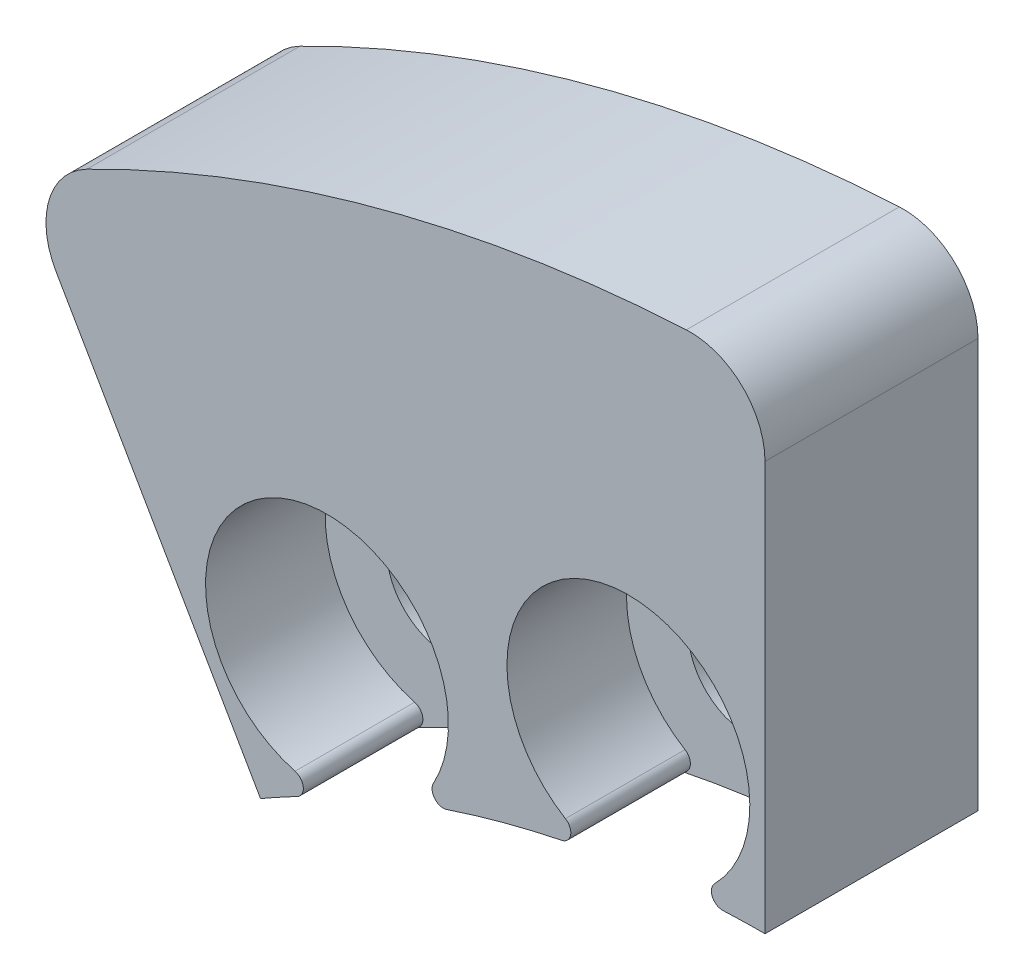
ISO-10303-21;
HEADER;
FILE_DESCRIPTION(('STEP AP214'),'2;1');
FILE_NAME('part.step','',(''),(''),'','','');
FILE_SCHEMA(('AUTOMOTIVE_DESIGN { 1 0 10303 214 1 1 1 1 }'));
ENDSEC;
DATA;
#1=APPLICATION_CONTEXT('core data for automotive mechanical design processes');
#2=APPLICATION_PROTOCOL_DEFINITION('international standard','automotive_design',2000,#1);
#3=PRODUCT_CONTEXT('',#1,'mechanical');
#4=PRODUCT('Part','Part','',(#3));
#5=PRODUCT_RELATED_PRODUCT_CATEGORY('part','',(#4));
#6=PRODUCT_DEFINITION_FORMATION('','',#4);
#7=PRODUCT_DEFINITION_CONTEXT('part definition',#1,'design');
#8=PRODUCT_DEFINITION('design','',#6,#7);
#9=PRODUCT_DEFINITION_SHAPE('','',#8);
#10=(LENGTH_UNIT() NAMED_UNIT(*) SI_UNIT(.MILLI.,.METRE.));
#11=(NAMED_UNIT(*) PLANE_ANGLE_UNIT() SI_UNIT($,.RADIAN.));
#12=(NAMED_UNIT(*) SI_UNIT($,.STERADIAN.) SOLID_ANGLE_UNIT());
#13=UNCERTAINTY_MEASURE_WITH_UNIT(LENGTH_MEASURE(1.E-05),#10,'distance_accuracy_value','');
#14=(GEOMETRIC_REPRESENTATION_CONTEXT(3) GLOBAL_UNCERTAINTY_ASSIGNED_CONTEXT((#13)) GLOBAL_UNIT_ASSIGNED_CONTEXT((#10,
#11,#12)) REPRESENTATION_CONTEXT('',''));
#15=CARTESIAN_POINT('',(0.,0.,0.));
#16=DIRECTION('',(0.,0.,1.));
#17=DIRECTION('',(1.,0.,0.));
#18=AXIS2_PLACEMENT_3D('',#15,#16,#17);
#19=CARTESIAN_POINT('',(0.,0.,6.));
#20=DIRECTION('',(-1.,0.,0.));
#21=DIRECTION('',(0.,0.,1.));
#22=AXIS2_PLACEMENT_3D('',#19,#20,#21);
#23=PLANE('',#22);
#24=DIRECTION('',(0.,1.,0.));
#25=VECTOR('',#24,1.);
#26=CARTESIAN_POINT('',(0.,27.,5.7));
#27=LINE('',#26,#25);
#28=CARTESIAN_POINT('',(0.,27.,5.7));
#29=VERTEX_POINT('',#28);
#30=CARTESIAN_POINT('',(0.,37.9473319220206,5.7));
#31=VERTEX_POINT('',#30);
#32=EDGE_CURVE('E145',#29,#31,#27,.T.);
#33=ORIENTED_EDGE('',*,*,#32,.F.);
#34=DIRECTION('',(0.,0.,1.));
#35=VECTOR('',#34,1.);
#36=CARTESIAN_POINT('',(0.,27.,0.));
#37=LINE('',#36,#35);
#38=CARTESIAN_POINT('',(0.,27.,0.));
#39=VERTEX_POINT('',#38);
#40=EDGE_CURVE('E155',#29,#39,#37,.F.);
#41=ORIENTED_EDGE('',*,*,#40,.T.);
#42=DIRECTION('',(0.,1.,0.));
#43=VECTOR('',#42,1.);
#44=CARTESIAN_POINT('',(0.,0.,0.));
#45=LINE('',#44,#43);
#46=CARTESIAN_POINT('',(0.,37.9473319220206,0.));
#47=VERTEX_POINT('',#46);
#48=EDGE_CURVE('E166',#39,#47,#45,.T.);
#49=ORIENTED_EDGE('',*,*,#48,.T.);
#50=DIRECTION('',(0.,0.,1.));
#51=VECTOR('',#50,1.);
#52=CARTESIAN_POINT('',(0.,37.9473319220206,0.));
#53=LINE('',#52,#51);
#54=EDGE_CURVE('E158',#47,#31,#53,.T.);
#55=ORIENTED_EDGE('',*,*,#54,.T.);
#56=EDGE_LOOP('',(#33,#41,#49,#55));
#57=FACE_BOUND('',#56,.T.);
#58=ADVANCED_FACE('F43',(#57),#23,.F.);
#59=CARTESIAN_POINT('',(0.,0.,6.));
#60=DIRECTION('',(-0.866025403784438,-0.500000000000001,0.));
#61=DIRECTION('',(0.500000000000001,-0.866025403784438,0.));
#62=AXIS2_PLACEMENT_3D('',#59,#60,#61);
#63=PLANE('',#62);
#64=DIRECTION('',(0.,0.,1.));
#65=VECTOR('',#64,1.);
#66=CARTESIAN_POINT('',(-13.5,23.3826859021798,0.));
#67=LINE('',#66,#65);
#68=CARTESIAN_POINT('',(-13.5,23.3826859021798,5.7));
#69=VERTEX_POINT('',#68);
#70=CARTESIAN_POINT('',(-13.5,23.3826859021798,0.));
#71=VERTEX_POINT('',#70);
#72=EDGE_CURVE('E167',#69,#71,#67,.F.);
#73=ORIENTED_EDGE('',*,*,#72,.F.);
#74=DIRECTION('',(0.499999999999997,-0.866025403784441,0.));
#75=VECTOR('',#74,1.);
#76=CARTESIAN_POINT('',(-18.9736659610103,32.86335345031,5.7));
#77=LINE('',#76,#75);
#78=CARTESIAN_POINT('',(-18.9736659610103,32.86335345031,5.7));
#79=VERTEX_POINT('',#78);
#80=EDGE_CURVE('E258',#79,#69,#77,.T.);
#81=ORIENTED_EDGE('',*,*,#80,.F.);
#82=DIRECTION('',(0.,0.,1.));
#83=VECTOR('',#82,1.);
#84=CARTESIAN_POINT('',(-18.9736659610103,32.86335345031,0.));
#85=LINE('',#84,#83);
#86=CARTESIAN_POINT('',(-18.9736659610103,32.86335345031,0.));
#87=VERTEX_POINT('',#86);
#88=EDGE_CURVE('E189',#79,#87,#85,.F.);
#89=ORIENTED_EDGE('',*,*,#88,.T.);
#90=DIRECTION('',(-0.500000000000001,0.866025403784438,0.));
#91=VECTOR('',#90,1.);
#92=CARTESIAN_POINT('',(0.,0.,0.));
#93=LINE('',#92,#91);
#94=EDGE_CURVE('E176',#71,#87,#93,.T.);
#95=ORIENTED_EDGE('',*,*,#94,.F.);
#96=EDGE_LOOP('',(#73,#81,#89,#95));
#97=FACE_BOUND('',#96,.T.);
#98=ADVANCED_FACE('F255',(#97),#63,.T.);
#99=CARTESIAN_POINT('',(0.,0.,0.));
#100=DIRECTION('',(0.,0.,1.));
#101=DIRECTION('',(1.,0.,0.));
#102=AXIS2_PLACEMENT_3D('',#99,#100,#101);
#103=CYLINDRICAL_SURFACE('',#102,40.);
#104=DIRECTION('',(0.,0.,1.));
#105=VECTOR('',#104,1.);
#106=CARTESIAN_POINT('',(-18.1490685825699,35.6456352108526,0.));
#107=LINE('',#106,#105);
#108=CARTESIAN_POINT('',(-18.1490685825699,35.6456352108526,0.));
#109=VERTEX_POINT('',#108);
#110=CARTESIAN_POINT('',(-18.1490685825699,35.6456352108526,5.7));
#111=VERTEX_POINT('',#110);
#112=EDGE_CURVE('E180',#109,#111,#107,.T.);
#113=ORIENTED_EDGE('',*,*,#112,.T.);
#114=CARTESIAN_POINT('',(0.,0.,5.7));
#115=DIRECTION('',(0.,0.,1.));
#116=DIRECTION('',(1.,0.,0.));
#117=AXIS2_PLACEMENT_3D('',#114,#115,#116);
#118=CIRCLE('',#117,40.);
#119=CARTESIAN_POINT('',(-2.10526315789474,39.9445599179164,5.7));
#120=VERTEX_POINT('',#119);
#121=EDGE_CURVE('E270',#120,#111,#118,.T.);
#122=ORIENTED_EDGE('',*,*,#121,.F.);
#123=DIRECTION('',(0.,0.,1.));
#124=VECTOR('',#123,1.);
#125=CARTESIAN_POINT('',(-2.10526315789474,39.9445599179164,0.));
#126=LINE('',#125,#124);
#127=CARTESIAN_POINT('',(-2.10526315789474,39.9445599179164,0.));
#128=VERTEX_POINT('',#127);
#129=EDGE_CURVE('E183',#120,#128,#126,.F.);
#130=ORIENTED_EDGE('',*,*,#129,.T.);
#131=CARTESIAN_POINT('',(0.,0.,0.));
#132=DIRECTION('',(0.,0.,1.));
#133=DIRECTION('',(1.,0.,0.));
#134=AXIS2_PLACEMENT_3D('',#131,#132,#133);
#135=CIRCLE('',#134,40.);
#136=EDGE_CURVE('E169',#128,#109,#135,.T.);
#137=ORIENTED_EDGE('',*,*,#136,.T.);
#138=EDGE_LOOP('',(#113,#122,#130,#137));
#139=FACE_BOUND('',#138,.T.);
#140=ADVANCED_FACE('F267',(#139),#103,.T.);
#141=CARTESIAN_POINT('',(0.,0.,0.));
#142=DIRECTION('',(0.,0.,1.));
#143=DIRECTION('',(1.,0.,0.));
#144=AXIS2_PLACEMENT_3D('',#141,#142,#143);
#145=CYLINDRICAL_SURFACE('',#144,27.);
#146=CARTESIAN_POINT('',(0.,0.,5.7));
#147=DIRECTION('',(0.,0.,-1.));
#148=DIRECTION('',(1.,0.,0.));
#149=AXIS2_PLACEMENT_3D('',#146,#147,#148);
#150=CIRCLE('',#149,27.);
#151=CARTESIAN_POINT('',(-12.5155935120846,23.9240447884605,5.7));
#152=VERTEX_POINT('',#151);
#153=EDGE_CURVE('E278',#69,#152,#150,.T.);
#154=ORIENTED_EDGE('',*,*,#153,.F.);
#155=ORIENTED_EDGE('',*,*,#72,.T.);
#156=CARTESIAN_POINT('',(0.,0.,0.));
#157=DIRECTION('',(0.,0.,1.));
#158=DIRECTION('',(1.,0.,0.));
#159=AXIS2_PLACEMENT_3D('',#156,#157,#158);
#160=CIRCLE('',#159,27.);
#161=EDGE_CURVE('E165',#39,#71,#160,.T.);
#162=ORIENTED_EDGE('',*,*,#161,.F.);
#163=ORIENTED_EDGE('',*,*,#40,.F.);
#164=CARTESIAN_POINT('',(0.,0.,5.7));
#165=DIRECTION('',(0.,0.,-1.));
#166=DIRECTION('',(1.,0.,0.));
#167=AXIS2_PLACEMENT_3D('',#164,#165,#166);
#168=CIRCLE('',#167,27.);
#169=CARTESIAN_POINT('',(-1.1232004693249,26.9766273041258,5.7));
#170=VERTEX_POINT('',#169);
#171=EDGE_CURVE('E142',#170,#29,#168,.T.);
#172=ORIENTED_EDGE('',*,*,#171,.F.);
#173=DIRECTION('',(0.,0.,1.));
#174=VECTOR('',#173,1.);
#175=CARTESIAN_POINT('',(-1.1232004693249,26.9766273041258,0.));
#176=LINE('',#175,#174);
#177=CARTESIAN_POINT('',(-1.1232004693249,26.9766273041258,2.5));
#178=VERTEX_POINT('',#177);
#179=EDGE_CURVE('E191',#170,#178,#176,.F.);
#180=ORIENTED_EDGE('',*,*,#179,.T.);
#181=CARTESIAN_POINT('',(0.,0.,2.5));
#182=DIRECTION('',(0.,0.,1.));
#183=DIRECTION('',(1.,0.,0.));
#184=AXIS2_PLACEMENT_3D('',#181,#182,#183);
#185=CIRCLE('',#184,27.);
#186=CARTESIAN_POINT('',(-5.43640019916238,26.4470329692113,2.5));
#187=VERTEX_POINT('',#186);
#188=EDGE_CURVE('E195',#187,#178,#185,.F.);
#189=ORIENTED_EDGE('',*,*,#188,.F.);
#190=DIRECTION('',(0.,0.,1.));
#191=VECTOR('',#190,1.);
#192=CARTESIAN_POINT('',(-5.43640019916238,26.4470329692113,0.));
#193=LINE('',#192,#191);
#194=CARTESIAN_POINT('',(-5.43640019916238,26.4470329692113,5.7));
#195=VERTEX_POINT('',#194);
#196=EDGE_CURVE('E202',#187,#195,#193,.T.);
#197=ORIENTED_EDGE('',*,*,#196,.T.);
#198=CARTESIAN_POINT('',(0.,0.,5.7));
#199=DIRECTION('',(0.,0.,-1.));
#200=DIRECTION('',(1.,0.,0.));
#201=AXIS2_PLACEMENT_3D('',#198,#199,#200);
#202=CIRCLE('',#201,27.);
#203=CARTESIAN_POINT('',(-8.51545580699189,25.6220025056428,5.7));
#204=VERTEX_POINT('',#203);
#205=EDGE_CURVE('E236',#204,#195,#202,.T.);
#206=ORIENTED_EDGE('',*,*,#205,.F.);
#207=DIRECTION('',(0.,0.,1.));
#208=VECTOR('',#207,1.);
#209=CARTESIAN_POINT('',(-8.51545580699189,25.6220025056428,0.));
#210=LINE('',#209,#208);
#211=CARTESIAN_POINT('',(-8.51545580699189,25.6220025056428,2.5));
#212=VERTEX_POINT('',#211);
#213=EDGE_CURVE('E205',#204,#212,#210,.F.);
#214=ORIENTED_EDGE('',*,*,#213,.T.);
#215=CARTESIAN_POINT('',(0.,0.,2.5));
#216=DIRECTION('',(0.,0.,1.));
#217=DIRECTION('',(1.,0.,0.));
#218=AXIS2_PLACEMENT_3D('',#215,#216,#217);
#219=CIRCLE('',#218,27.);
#220=CARTESIAN_POINT('',(-12.5155935120847,23.9240447884605,2.5));
#221=VERTEX_POINT('',#220);
#222=EDGE_CURVE('E200',#221,#212,#219,.F.);
#223=ORIENTED_EDGE('',*,*,#222,.F.);
#224=DIRECTION('',(0.,0.,1.));
#225=VECTOR('',#224,1.);
#226=CARTESIAN_POINT('',(-12.5155935120847,23.9240447884605,0.));
#227=LINE('',#226,#225);
#228=EDGE_CURVE('E207',#221,#152,#227,.T.);
#229=ORIENTED_EDGE('',*,*,#228,.T.);
#230=EDGE_LOOP('',(#154,#155,#162,#163,#172,#180,#189,#197,#206,#214,#223,#229));
#231=FACE_BOUND('',#230,.T.);
#232=ADVANCED_FACE('F163',(#231),#145,.F.);
#233=CARTESIAN_POINT('',(-2.,37.9473319220206,0.));
#234=DIRECTION('',(0.,0.,1.));
#235=DIRECTION('',(1.,0.,0.));
#236=AXIS2_PLACEMENT_3D('',#233,#234,#235);
#237=CYLINDRICAL_SURFACE('',#236,2.);
#238=ORIENTED_EDGE('',*,*,#129,.F.);
#239=CARTESIAN_POINT('',(-2.,37.9473319220206,5.7));
#240=DIRECTION('',(0.,0.,1.));
#241=DIRECTION('',(1.,0.,0.));
#242=AXIS2_PLACEMENT_3D('',#239,#240,#241);
#243=CIRCLE('',#242,2.);
#244=EDGE_CURVE('E159',#31,#120,#243,.T.);
#245=ORIENTED_EDGE('',*,*,#244,.F.);
#246=ORIENTED_EDGE('',*,*,#54,.F.);
#247=CARTESIAN_POINT('',(-2.,37.9473319220206,0.));
#248=DIRECTION('',(0.,0.,1.));
#249=DIRECTION('',(1.,0.,0.));
#250=AXIS2_PLACEMENT_3D('',#247,#248,#249);
#251=CIRCLE('',#250,2.);
#252=EDGE_CURVE('E187',#128,#47,#251,.F.);
#253=ORIENTED_EDGE('',*,*,#252,.F.);
#254=EDGE_LOOP('',(#238,#245,#246,#253));
#255=FACE_BOUND('',#254,.T.);
#256=ADVANCED_FACE('F272',(#255),#237,.T.);
#257=CARTESIAN_POINT('',(-17.2416151534414,33.86335345031,0.));
#258=DIRECTION('',(0.,0.,1.));
#259=DIRECTION('',(1.,0.,0.));
#260=AXIS2_PLACEMENT_3D('',#257,#258,#259);
#261=CYLINDRICAL_SURFACE('',#260,2.);
#262=ORIENTED_EDGE('',*,*,#88,.F.);
#263=CARTESIAN_POINT('',(-17.2416151534414,33.86335345031,5.7));
#264=DIRECTION('',(0.,0.,1.));
#265=DIRECTION('',(1.,0.,0.));
#266=AXIS2_PLACEMENT_3D('',#263,#264,#265);
#267=CIRCLE('',#266,2.);
#268=EDGE_CURVE('E263',#111,#79,#267,.T.);
#269=ORIENTED_EDGE('',*,*,#268,.F.);
#270=ORIENTED_EDGE('',*,*,#112,.F.);
#271=CARTESIAN_POINT('',(-17.2416151534414,33.86335345031,0.));
#272=DIRECTION('',(0.,0.,1.));
#273=DIRECTION('',(1.,0.,0.));
#274=AXIS2_PLACEMENT_3D('',#271,#272,#273);
#275=CIRCLE('',#274,2.);
#276=EDGE_CURVE('E185',#87,#109,#275,.F.);
#277=ORIENTED_EDGE('',*,*,#276,.F.);
#278=EDGE_LOOP('',(#262,#269,#270,#277));
#279=FACE_BOUND('',#278,.T.);
#280=ADVANCED_FACE('F261',(#279),#261,.T.);
#281=CARTESIAN_POINT('',(-3.65608030215423,29.7763845492397,2.5));
#282=DIRECTION('',(0.,0.,1.));
#283=DIRECTION('',(1.,0.,0.));
#284=AXIS2_PLACEMENT_3D('',#281,#282,#283);
#285=CYLINDRICAL_SURFACE('',#284,3.25);
#286=CARTESIAN_POINT('',(-3.65608030215423,29.7763845492397,5.7));
#287=DIRECTION('',(0.,0.,-1.));
#288=DIRECTION('',(1.,0.,0.));
#289=AXIS2_PLACEMENT_3D('',#286,#287,#288);
#290=CIRCLE('',#289,3.25);
#291=CARTESIAN_POINT('',(-5.34125047593252,26.9974096509349,5.7));
#292=VERTEX_POINT('',#291);
#293=CARTESIAN_POINT('',(-1.34867200926762,27.4876366448347,5.7));
#294=VERTEX_POINT('',#293);
#295=EDGE_CURVE('E58',#292,#294,#290,.T.);
#296=ORIENTED_EDGE('',*,*,#295,.F.);
#297=DIRECTION('',(0.,0.,1.));
#298=VECTOR('',#297,1.);
#299=CARTESIAN_POINT('',(-5.34125047593252,26.9974096509349,2.5));
#300=LINE('',#299,#298);
#301=CARTESIAN_POINT('',(-5.34125047593252,26.9974096509349,2.5));
#302=VERTEX_POINT('',#301);
#303=EDGE_CURVE('E65',#292,#302,#300,.F.);
#304=ORIENTED_EDGE('',*,*,#303,.T.);
#305=CARTESIAN_POINT('',(-3.65608030215423,29.7763845492397,2.5));
#306=DIRECTION('',(0.,0.,1.));
#307=DIRECTION('',(1.,0.,0.));
#308=AXIS2_PLACEMENT_3D('',#305,#306,#307);
#309=CIRCLE('',#308,3.25);
#310=CARTESIAN_POINT('',(-1.34867200926762,27.4876366448347,2.5));
#311=VERTEX_POINT('',#310);
#312=EDGE_CURVE('E230',#311,#302,#309,.T.);
#313=ORIENTED_EDGE('',*,*,#312,.F.);
#314=DIRECTION('',(0.,0.,1.));
#315=VECTOR('',#314,1.);
#316=CARTESIAN_POINT('',(-1.34867200926762,27.4876366448347,2.5));
#317=LINE('',#316,#315);
#318=EDGE_CURVE('E215',#311,#294,#317,.T.);
#319=ORIENTED_EDGE('',*,*,#318,.T.);
#320=EDGE_LOOP('',(#296,#304,#313,#319));
#321=FACE_BOUND('',#320,.T.);
#322=ADVANCED_FACE('F307',(#321),#285,.F.);
#323=CARTESIAN_POINT('',(-11.721933854678,27.6151456035733,2.5));
#324=DIRECTION('',(0.,0.,1.));
#325=DIRECTION('',(1.,0.,0.));
#326=AXIS2_PLACEMENT_3D('',#323,#324,#325);
#327=CYLINDRICAL_SURFACE('',#326,3.25);
#328=CARTESIAN_POINT('',(-11.721933854678,27.6151456035733,5.7));
#329=DIRECTION('',(0.,0.,-1.));
#330=DIRECTION('',(1.,0.,0.));
#331=AXIS2_PLACEMENT_3D('',#328,#329,#330);
#332=CIRCLE('',#331,3.25);
#333=CARTESIAN_POINT('',(-12.5758341010183,24.4793276290569,5.7));
#334=VERTEX_POINT('',#333);
#335=CARTESIAN_POINT('',(-8.87304622533384,26.0510678320512,5.7));
#336=VERTEX_POINT('',#335);
#337=EDGE_CURVE('E282',#334,#336,#332,.T.);
#338=ORIENTED_EDGE('',*,*,#337,.F.);
#339=DIRECTION('',(0.,0.,1.));
#340=VECTOR('',#339,1.);
#341=CARTESIAN_POINT('',(-12.5758341010183,24.4793276290569,2.5));
#342=LINE('',#341,#340);
#343=CARTESIAN_POINT('',(-12.5758341010183,24.4793276290569,2.5));
#344=VERTEX_POINT('',#343);
#345=EDGE_CURVE('E213',#334,#344,#342,.F.);
#346=ORIENTED_EDGE('',*,*,#345,.T.);
#347=CARTESIAN_POINT('',(-11.721933854678,27.6151456035733,2.5));
#348=DIRECTION('',(0.,0.,1.));
#349=DIRECTION('',(1.,0.,0.));
#350=AXIS2_PLACEMENT_3D('',#347,#348,#349);
#351=CIRCLE('',#350,3.25);
#352=CARTESIAN_POINT('',(-8.87304622533384,26.0510678320512,2.5));
#353=VERTEX_POINT('',#352);
#354=EDGE_CURVE('E196',#353,#344,#351,.T.);
#355=ORIENTED_EDGE('',*,*,#354,.F.);
#356=DIRECTION('',(0.,0.,1.));
#357=VECTOR('',#356,1.);
#358=CARTESIAN_POINT('',(-8.87304622533384,26.0510678320512,2.5));
#359=LINE('',#358,#357);
#360=EDGE_CURVE('E210',#353,#336,#359,.T.);
#361=ORIENTED_EDGE('',*,*,#360,.T.);
#362=EDGE_LOOP('',(#338,#346,#355,#361));
#363=FACE_BOUND('',#362,.T.);
#364=ADVANCED_FACE('F306',(#363),#327,.F.);
#365=CARTESIAN_POINT('',(-12.6546556622189,24.1898675083323,2.5));
#366=DIRECTION('',(0.,0.,1.));
#367=DIRECTION('',(1.,0.,0.));
#368=AXIS2_PLACEMENT_3D('',#365,#366,#367);
#369=CYLINDRICAL_SURFACE('',#368,0.3);
#370=ORIENTED_EDGE('',*,*,#345,.F.);
#371=CARTESIAN_POINT('',(-12.6546556622189,24.1898675083323,5.7));
#372=DIRECTION('',(0.,0.,1.));
#373=DIRECTION('',(1.,0.,0.));
#374=AXIS2_PLACEMENT_3D('',#371,#372,#373);
#375=CIRCLE('',#374,0.300000000000002);
#376=EDGE_CURVE('E280',#152,#334,#375,.T.);
#377=ORIENTED_EDGE('',*,*,#376,.F.);
#378=ORIENTED_EDGE('',*,*,#228,.F.);
#379=CARTESIAN_POINT('',(-12.6546556622189,24.1898675083323,2.5));
#380=DIRECTION('',(0.,0.,1.));
#381=DIRECTION('',(1.,0.,0.));
#382=AXIS2_PLACEMENT_3D('',#379,#380,#381);
#383=CIRCLE('',#382,0.3);
#384=EDGE_CURVE('E219',#344,#221,#383,.F.);
#385=ORIENTED_EDGE('',*,*,#384,.F.);
#386=EDGE_LOOP('',(#370,#377,#378,#385));
#387=FACE_BOUND('',#386,.T.);
#388=ADVANCED_FACE('F300',(#387),#369,.T.);
#389=CARTESIAN_POINT('',(-8.61007198262514,25.9066914223722,2.5));
#390=DIRECTION('',(0.,0.,-1.));
#391=DIRECTION('',(-1.,0.,0.));
#392=AXIS2_PLACEMENT_3D('',#389,#390,#391);
#393=CYLINDRICAL_SURFACE('',#392,0.3);
#394=ORIENTED_EDGE('',*,*,#213,.F.);
#395=CARTESIAN_POINT('',(-8.61007198262514,25.9066914223722,5.7));
#396=DIRECTION('',(0.,0.,1.));
#397=DIRECTION('',(1.,0.,0.));
#398=AXIS2_PLACEMENT_3D('',#395,#396,#397);
#399=CIRCLE('',#398,0.300000000000004);
#400=EDGE_CURVE('E284',#336,#204,#399,.T.);
#401=ORIENTED_EDGE('',*,*,#400,.F.);
#402=ORIENTED_EDGE('',*,*,#360,.F.);
#403=CARTESIAN_POINT('',(-8.61007198262514,25.9066914223722,2.5));
#404=DIRECTION('',(0.,0.,1.));
#405=DIRECTION('',(1.,0.,0.));
#406=AXIS2_PLACEMENT_3D('',#403,#404,#405);
#407=CIRCLE('',#406,0.3);
#408=EDGE_CURVE('E222',#212,#353,#407,.F.);
#409=ORIENTED_EDGE('',*,*,#408,.F.);
#410=EDGE_LOOP('',(#394,#401,#402,#409));
#411=FACE_BOUND('',#410,.T.);
#412=ADVANCED_FACE('F303',(#411),#393,.T.);
#413=CARTESIAN_POINT('',(-5.49680464581974,26.7408888910914,2.5));
#414=DIRECTION('',(0.,0.,1.));
#415=DIRECTION('',(1.,0.,0.));
#416=AXIS2_PLACEMENT_3D('',#413,#414,#415);
#417=CYLINDRICAL_SURFACE('',#416,0.3);
#418=ORIENTED_EDGE('',*,*,#303,.F.);
#419=CARTESIAN_POINT('',(-5.49680464581974,26.7408888910914,5.7));
#420=DIRECTION('',(0.,0.,1.));
#421=DIRECTION('',(1.,0.,0.));
#422=AXIS2_PLACEMENT_3D('',#419,#420,#421);
#423=CIRCLE('',#422,0.300000000000003);
#424=EDGE_CURVE('E234',#195,#292,#423,.T.);
#425=ORIENTED_EDGE('',*,*,#424,.F.);
#426=ORIENTED_EDGE('',*,*,#196,.F.);
#427=CARTESIAN_POINT('',(-5.49680464581974,26.7408888910914,2.5));
#428=DIRECTION('',(0.,0.,1.));
#429=DIRECTION('',(1.,0.,0.));
#430=AXIS2_PLACEMENT_3D('',#427,#428,#429);
#431=CIRCLE('',#430,0.3);
#432=EDGE_CURVE('E51',#302,#187,#431,.F.);
#433=ORIENTED_EDGE('',*,*,#432,.F.);
#434=EDGE_LOOP('',(#418,#425,#426,#433));
#435=FACE_BOUND('',#434,.T.);
#436=ADVANCED_FACE('F233',(#435),#417,.T.);
#437=CARTESIAN_POINT('',(-1.13568047453962,27.276367607505,2.5));
#438=DIRECTION('',(0.,0.,-1.));
#439=DIRECTION('',(-1.,0.,0.));
#440=AXIS2_PLACEMENT_3D('',#437,#438,#439);
#441=CYLINDRICAL_SURFACE('',#440,0.3);
#442=ORIENTED_EDGE('',*,*,#179,.F.);
#443=CARTESIAN_POINT('',(-1.13568047453962,27.276367607505,5.7));
#444=DIRECTION('',(0.,0.,1.));
#445=DIRECTION('',(1.,0.,0.));
#446=AXIS2_PLACEMENT_3D('',#443,#444,#445);
#447=CIRCLE('',#446,0.300000000000003);
#448=EDGE_CURVE('E147',#294,#170,#447,.T.);
#449=ORIENTED_EDGE('',*,*,#448,.F.);
#450=ORIENTED_EDGE('',*,*,#318,.F.);
#451=CARTESIAN_POINT('',(-1.13568047453962,27.276367607505,2.5));
#452=DIRECTION('',(0.,0.,1.));
#453=DIRECTION('',(1.,0.,0.));
#454=AXIS2_PLACEMENT_3D('',#451,#452,#453);
#455=CIRCLE('',#454,0.3);
#456=EDGE_CURVE('E11',#178,#311,#455,.F.);
#457=ORIENTED_EDGE('',*,*,#456,.F.);
#458=EDGE_LOOP('',(#442,#449,#450,#457));
#459=FACE_BOUND('',#458,.T.);
#460=ADVANCED_FACE('F45',(#459),#441,.T.);
#461=CARTESIAN_POINT('',(-11.721933854678,27.6151456035733,0.));
#462=DIRECTION('',(0.,0.,1.));
#463=DIRECTION('',(1.,0.,0.));
#464=AXIS2_PLACEMENT_3D('',#461,#462,#463);
#465=CYLINDRICAL_SURFACE('',#464,1.6);
#466=CARTESIAN_POINT('',(-11.721933854678,27.6151456035733,0.));
#467=DIRECTION('',(0.,0.,1.));
#468=DIRECTION('',(1.,0.,0.));
#469=AXIS2_PLACEMENT_3D('',#466,#467,#468);
#470=CIRCLE('',#469,1.6);
#471=CARTESIAN_POINT('',(-10.121933854678,27.6151456035733,0.));
#472=VERTEX_POINT('',#471);
#473=EDGE_CURVE('E244',#472,#472,#470,.T.);
#474=ORIENTED_EDGE('',*,*,#473,.F.);
#475=EDGE_LOOP('',(#474));
#476=FACE_BOUND('',#475,.T.);
#477=CARTESIAN_POINT('',(-11.721933854678,27.6151456035733,2.5));
#478=DIRECTION('',(0.,0.,1.));
#479=DIRECTION('',(1.,0.,0.));
#480=AXIS2_PLACEMENT_3D('',#477,#478,#479);
#481=CIRCLE('',#480,1.6);
#482=CARTESIAN_POINT('',(-10.121933854678,27.6151456035733,2.5));
#483=VERTEX_POINT('',#482);
#484=EDGE_CURVE('E197',#483,#483,#481,.F.);
#485=ORIENTED_EDGE('',*,*,#484,.F.);
#486=EDGE_LOOP('',(#485));
#487=FACE_BOUND('',#486,.T.);
#488=ADVANCED_FACE('F311',(#476,#487),#465,.F.);
#489=CARTESIAN_POINT('',(-3.65608030215423,29.7763845492397,0.));
#490=DIRECTION('',(0.,0.,1.));
#491=DIRECTION('',(1.,0.,0.));
#492=AXIS2_PLACEMENT_3D('',#489,#490,#491);
#493=CYLINDRICAL_SURFACE('',#492,1.6);
#494=CARTESIAN_POINT('',(-3.65608030215423,29.7763845492397,0.));
#495=DIRECTION('',(0.,0.,1.));
#496=DIRECTION('',(1.,0.,0.));
#497=AXIS2_PLACEMENT_3D('',#494,#495,#496);
#498=CIRCLE('',#497,1.6);
#499=CARTESIAN_POINT('',(-2.05608030215423,29.7763845492397,0.));
#500=VERTEX_POINT('',#499);
#501=EDGE_CURVE('E245',#500,#500,#498,.T.);
#502=ORIENTED_EDGE('',*,*,#501,.F.);
#503=EDGE_LOOP('',(#502));
#504=FACE_BOUND('',#503,.T.);
#505=CARTESIAN_POINT('',(-3.65608030215423,29.7763845492397,2.5));
#506=DIRECTION('',(0.,0.,1.));
#507=DIRECTION('',(1.,0.,0.));
#508=AXIS2_PLACEMENT_3D('',#505,#506,#507);
#509=CIRCLE('',#508,1.6);
#510=CARTESIAN_POINT('',(-2.05608030215423,29.7763845492397,2.5));
#511=VERTEX_POINT('',#510);
#512=EDGE_CURVE('E192',#511,#511,#509,.F.);
#513=ORIENTED_EDGE('',*,*,#512,.F.);
#514=EDGE_LOOP('',(#513));
#515=FACE_BOUND('',#514,.T.);
#516=ADVANCED_FACE('F317',(#504,#515),#493,.F.);
#517=CARTESIAN_POINT('',(0.,0.,0.));
#518=DIRECTION('',(0.,0.,1.));
#519=DIRECTION('',(1.,0.,0.));
#520=AXIS2_PLACEMENT_3D('',#517,#518,#519);
#521=PLANE('',#520);
#522=ORIENTED_EDGE('',*,*,#501,.T.);
#523=EDGE_LOOP('',(#522));
#524=FACE_BOUND('',#523,.T.);
#525=ORIENTED_EDGE('',*,*,#473,.T.);
#526=EDGE_LOOP('',(#525));
#527=FACE_BOUND('',#526,.T.);
#528=ORIENTED_EDGE('',*,*,#48,.F.);
#529=ORIENTED_EDGE('',*,*,#161,.T.);
#530=ORIENTED_EDGE('',*,*,#94,.T.);
#531=ORIENTED_EDGE('',*,*,#276,.T.);
#532=ORIENTED_EDGE('',*,*,#136,.F.);
#533=ORIENTED_EDGE('',*,*,#252,.T.);
#534=EDGE_LOOP('',(#528,#529,#530,#531,#532,#533));
#535=FACE_BOUND('',#534,.T.);
#536=ADVANCED_FACE('F251',(#524,#527,#535),#521,.F.);
#537=CARTESIAN_POINT('',(-3.65608030215423,29.7763845492397,2.5));
#538=DIRECTION('',(0.,0.,1.));
#539=DIRECTION('',(1.,0.,0.));
#540=AXIS2_PLACEMENT_3D('',#537,#538,#539);
#541=PLANE('',#540);
#542=ORIENTED_EDGE('',*,*,#512,.T.);
#543=EDGE_LOOP('',(#542));
#544=FACE_BOUND('',#543,.T.);
#545=ORIENTED_EDGE('',*,*,#188,.T.);
#546=ORIENTED_EDGE('',*,*,#456,.T.);
#547=ORIENTED_EDGE('',*,*,#312,.T.);
#548=ORIENTED_EDGE('',*,*,#432,.T.);
#549=EDGE_LOOP('',(#545,#546,#547,#548));
#550=FACE_BOUND('',#549,.T.);
#551=ADVANCED_FACE('F228',(#544,#550),#541,.T.);
#552=CARTESIAN_POINT('',(-11.721933854678,27.6151456035733,2.5));
#553=DIRECTION('',(0.,0.,1.));
#554=DIRECTION('',(1.,0.,0.));
#555=AXIS2_PLACEMENT_3D('',#552,#553,#554);
#556=PLANE('',#555);
#557=ORIENTED_EDGE('',*,*,#484,.T.);
#558=EDGE_LOOP('',(#557));
#559=FACE_BOUND('',#558,.T.);
#560=ORIENTED_EDGE('',*,*,#222,.T.);
#561=ORIENTED_EDGE('',*,*,#408,.T.);
#562=ORIENTED_EDGE('',*,*,#354,.T.);
#563=ORIENTED_EDGE('',*,*,#384,.T.);
#564=EDGE_LOOP('',(#560,#561,#562,#563));
#565=FACE_BOUND('',#564,.T.);
#566=ADVANCED_FACE('F293',(#559,#565),#556,.T.);
#567=CARTESIAN_POINT('',(0.,0.,5.7));
#568=DIRECTION('',(0.,0.,1.));
#569=DIRECTION('',(1.,0.,0.));
#570=AXIS2_PLACEMENT_3D('',#567,#568,#569);
#571=PLANE('',#570);
#572=ORIENTED_EDGE('',*,*,#171,.T.);
#573=ORIENTED_EDGE('',*,*,#32,.T.);
#574=ORIENTED_EDGE('',*,*,#244,.T.);
#575=ORIENTED_EDGE('',*,*,#121,.T.);
#576=ORIENTED_EDGE('',*,*,#268,.T.);
#577=ORIENTED_EDGE('',*,*,#80,.T.);
#578=ORIENTED_EDGE('',*,*,#153,.T.);
#579=ORIENTED_EDGE('',*,*,#376,.T.);
#580=ORIENTED_EDGE('',*,*,#337,.T.);
#581=ORIENTED_EDGE('',*,*,#400,.T.);
#582=ORIENTED_EDGE('',*,*,#205,.T.);
#583=ORIENTED_EDGE('',*,*,#424,.T.);
#584=ORIENTED_EDGE('',*,*,#295,.T.);
#585=ORIENTED_EDGE('',*,*,#448,.T.);
#586=EDGE_LOOP('',(#572,#573,#574,#575,#576,#577,#578,#579,#580,#581,#582,#583,#584,#585));
#587=FACE_BOUND('',#586,.T.);
#588=ADVANCED_FACE('F144',(#587),#571,.T.);
#589=CLOSED_SHELL('',(#58,#98,#140,#232,#256,#280,#322,#364,#388,#412,#436,#460,#488,#516,#536,
#551,#566,#588));
#590=MANIFOLD_SOLID_BREP('B2',#589);
#591=ADVANCED_BREP_SHAPE_REPRESENTATION('',(#18,#590),#14);
#592=SHAPE_DEFINITION_REPRESENTATION(#9,#591);
ENDSEC;
END-ISO-10303-21;
